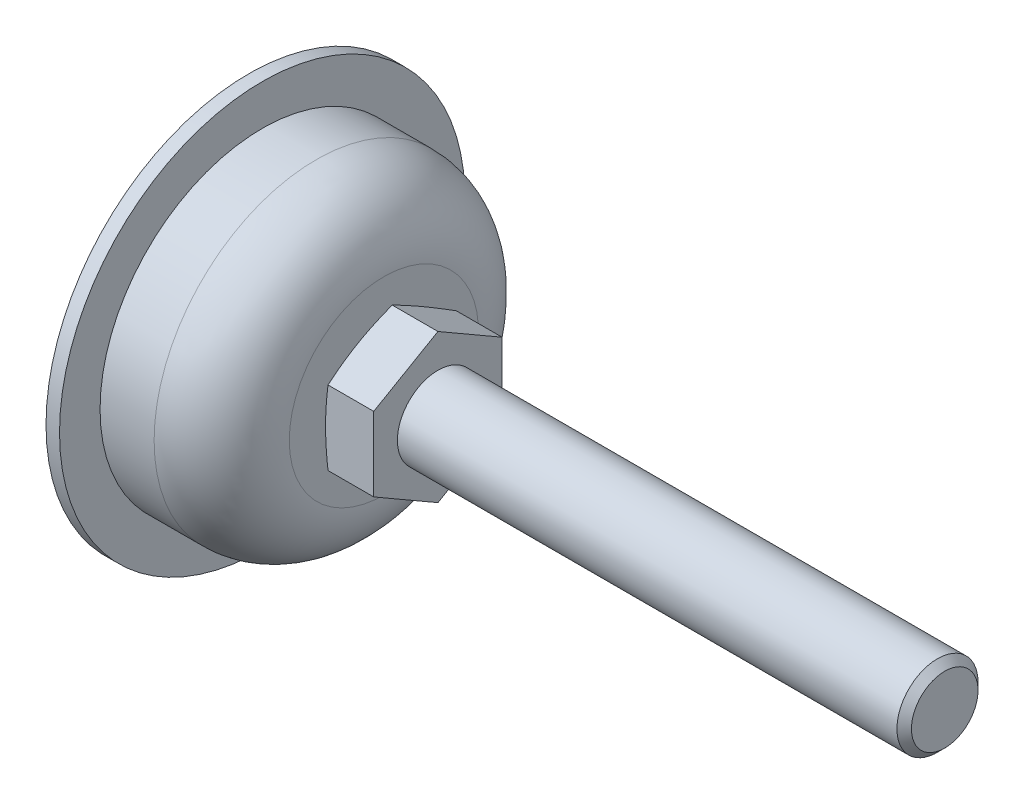
ISO-10303-21;
HEADER;
FILE_DESCRIPTION(('STEP AP214'),'2;1');
FILE_NAME('part.step','',(''),(''),'','','');
FILE_SCHEMA(('AUTOMOTIVE_DESIGN { 1 0 10303 214 1 1 1 1 }'));
ENDSEC;
DATA;
#1=APPLICATION_CONTEXT('core data for automotive mechanical design processes');
#2=APPLICATION_PROTOCOL_DEFINITION('international standard','automotive_design',2000,#1);
#3=PRODUCT_CONTEXT('',#1,'mechanical');
#4=PRODUCT('Part','Part','',(#3));
#5=PRODUCT_RELATED_PRODUCT_CATEGORY('part','',(#4));
#6=PRODUCT_DEFINITION_FORMATION('','',#4);
#7=PRODUCT_DEFINITION_CONTEXT('part definition',#1,'design');
#8=PRODUCT_DEFINITION('design','',#6,#7);
#9=PRODUCT_DEFINITION_SHAPE('','',#8);
#10=(LENGTH_UNIT() NAMED_UNIT(*) SI_UNIT(.MILLI.,.METRE.));
#11=(NAMED_UNIT(*) PLANE_ANGLE_UNIT() SI_UNIT($,.RADIAN.));
#12=(NAMED_UNIT(*) SI_UNIT($,.STERADIAN.) SOLID_ANGLE_UNIT());
#13=UNCERTAINTY_MEASURE_WITH_UNIT(LENGTH_MEASURE(1.E-05),#10,'distance_accuracy_value','');
#14=(GEOMETRIC_REPRESENTATION_CONTEXT(3) GLOBAL_UNCERTAINTY_ASSIGNED_CONTEXT((#13)) GLOBAL_UNIT_ASSIGNED_CONTEXT((#10,
#11,#12)) REPRESENTATION_CONTEXT('',''));
#15=CARTESIAN_POINT('',(0.,0.,0.));
#16=DIRECTION('',(0.,0.,1.));
#17=DIRECTION('',(1.,0.,0.));
#18=AXIS2_PLACEMENT_3D('',#15,#16,#17);
#19=CARTESIAN_POINT('',(20.,5.4848275573014,-9.5));
#20=DIRECTION('',(0.,0.866025403784432,-0.500000000000011));
#21=DIRECTION('',(0.,0.500000000000011,0.866025403784432));
#22=AXIS2_PLACEMENT_3D('',#19,#20,#21);
#23=PLANE('',#22);
#24=CARTESIAN_POINT('',(21.2363135473318,10.9696551146014,-2.83738518010629E-12));
#25=CARTESIAN_POINT('',(21.1796025206193,10.7417796133134,-0.39469194603377));
#26=CARTESIAN_POINT('',(21.1281356347118,10.5135471527352,-0.790002163691614));
#27=CARTESIAN_POINT('',(21.0377338744024,10.0563872687917,-1.58182630986411));
#28=CARTESIAN_POINT('',(20.9988033550502,9.82745963174504,-1.97834060848559));
#29=CARTESIAN_POINT('',(20.9357010995206,9.37010728521882,-2.77049810962984));
#30=CARTESIAN_POINT('',(20.9114644096468,9.14168487616794,-3.16613732769323));
#31=CARTESIAN_POINT('',(20.8789670631554,8.68458873301923,-3.95785107157056));
#32=CARTESIAN_POINT('',(20.8707037649087,8.4559150467366,-4.35392551456613));
#33=CARTESIAN_POINT('',(20.8707037637354,7.99856767415284,-5.14607440058931));
#34=CARTESIAN_POINT('',(20.8789670608093,7.76989398785171,-5.54214884361692));
#35=CARTESIAN_POINT('',(20.911464405033,7.31279784464755,-6.33386258759027));
#36=CARTESIAN_POINT('',(20.9357010938117,7.08437543555973,-6.72950180571766));
#37=CARTESIAN_POINT('',(20.998803347279,6.62702308894837,-7.52165930700936));
#38=CARTESIAN_POINT('',(21.0377338656645,6.39809545185347,-7.9181736057144));
#39=CARTESIAN_POINT('',(21.1281356241903,5.94093556780653,-8.70999775206598));
#40=CARTESIAN_POINT('',(21.1796025092811,5.71270310717321,-9.10530796981933));
#41=CARTESIAN_POINT('',(21.2363135352593,5.48482760583112,-9.49999991594406));
#42=B_SPLINE_CURVE_WITH_KNOTS('',3,(#24,#25,#26,#27,#28,#29,#30,#31,#32,#33,#34,#35,#36,#37,#38,
#39,#40,#41),.UNSPECIFIED.,.F.,.F.,(4,2,2,2,2,2,2,2,4),(0.,1.37785904683427,2.75619623756216,
4.12839523405715,5.50036728119311,6.87233932837504,8.24453832491363,9.62287551568004,
11.0007345625643),.UNSPECIFIED.);
#43=CARTESIAN_POINT('',(21.2363135473339,10.969655114603,0.));
#44=VERTEX_POINT('',#43);
#45=CARTESIAN_POINT('',(21.2363135473339,5.4848275573014,-9.5));
#46=VERTEX_POINT('',#45);
#47=EDGE_CURVE('E130',#44,#46,#42,.T.);
#48=ORIENTED_EDGE('',*,*,#47,.F.);
#49=DIRECTION('',(-1.,0.,0.));
#50=VECTOR('',#49,1.);
#51=CARTESIAN_POINT('',(28.,10.969655114603,0.));
#52=LINE('',#51,#50);
#53=CARTESIAN_POINT('',(28.,10.969655114603,0.));
#54=VERTEX_POINT('',#53);
#55=EDGE_CURVE('E119',#54,#44,#52,.T.);
#56=ORIENTED_EDGE('',*,*,#55,.F.);
#57=DIRECTION('',(0.,0.500000000000011,0.866025403784432));
#58=VECTOR('',#57,1.);
#59=CARTESIAN_POINT('',(28.,10.969655114603,0.));
#60=LINE('',#59,#58);
#61=CARTESIAN_POINT('',(28.,5.4848275573014,-9.5));
#62=VERTEX_POINT('',#61);
#63=EDGE_CURVE('E107',#62,#54,#60,.T.);
#64=ORIENTED_EDGE('',*,*,#63,.F.);
#65=DIRECTION('',(-1.,0.,0.));
#66=VECTOR('',#65,1.);
#67=CARTESIAN_POINT('',(28.,5.4848275573014,-9.5));
#68=LINE('',#67,#66);
#69=EDGE_CURVE('E273',#62,#46,#68,.T.);
#70=ORIENTED_EDGE('',*,*,#69,.T.);
#71=EDGE_LOOP('',(#48,#56,#64,#70));
#72=FACE_BOUND('',#71,.T.);
#73=ADVANCED_FACE('F40',(#72),#23,.T.);
#74=CARTESIAN_POINT('',(20.,-5.4848275573014,-9.5));
#75=DIRECTION('',(0.,0.,-1.));
#76=DIRECTION('',(-1.,0.,0.));
#77=AXIS2_PLACEMENT_3D('',#74,#75,#76);
#78=PLANE('',#77);
#79=CARTESIAN_POINT('',(21.2363135868258,5.48482759939457,-9.49999995796774));
#80=CARTESIAN_POINT('',(21.1796025378282,5.02907659701606,-9.49999998490571));
#81=CARTESIAN_POINT('',(21.1281356424214,4.57261167461967,-9.49999999595545));
#82=CARTESIAN_POINT('',(21.037733874454,3.65829190312086,-9.50000000404596));
#83=CARTESIAN_POINT('',(20.9988033569429,3.20043662665583,-9.50000000108186));
#84=CARTESIAN_POINT('',(20.9357011021749,2.28573192940763,-9.49999999892296));
#85=CARTESIAN_POINT('',(20.9114644112277,1.8288871094809,-9.49999999971142));
#86=CARTESIAN_POINT('',(20.8789670635043,0.914694819364156,-9.50000000028853));
#87=CARTESIAN_POINT('',(20.870703765101,0.457347444804493,-9.50000000007734));
#88=CARTESIAN_POINT('',(20.8707037635431,-0.457347304044417,-9.49999999992266));
#89=CARTESIAN_POINT('',(20.8789670603785,-0.914694678333665,-9.49999999997917));
#90=CARTESIAN_POINT('',(20.9114644043119,-1.82888696807866,-9.50000000002083));
#91=CARTESIAN_POINT('',(20.9357010930374,-2.28573178790406,-9.50000000000596));
#92=CARTESIAN_POINT('',(20.9988033465166,-3.20043648462128,-9.49999999999401));
#93=CARTESIAN_POINT('',(21.0377338649741,-3.65829176065535,-9.49999999999701));
#94=CARTESIAN_POINT('',(21.1281356237596,-4.57261153249546,-9.50000000000299));
#95=CARTESIAN_POINT('',(21.1796025090401,-5.02907645566386,-9.50000000000598));
#96=CARTESIAN_POINT('',(21.2363135352595,-5.48482746024407,-9.5));
#97=B_SPLINE_CURVE_WITH_KNOTS('',3,(#79,#80,#81,#82,#83,#84,#85,#86,#87,#88,#89,#90,#91,#92,#93,
#94,#95,#96),.UNSPECIFIED.,.F.,.F.,(4,2,2,2,2,2,2,2,4),(0.,1.3778590537026,2.75619625085898,
4.12839525310159,5.50036730617691,6.87233935842028,8.24453835988346,9.62287555618,
11.000734608796),.UNSPECIFIED.);
#98=CARTESIAN_POINT('',(21.2363135473339,-5.4848275573014,-9.5));
#99=VERTEX_POINT('',#98);
#100=EDGE_CURVE('E274',#46,#99,#97,.T.);
#101=ORIENTED_EDGE('',*,*,#100,.F.);
#102=ORIENTED_EDGE('',*,*,#69,.F.);
#103=DIRECTION('',(0.,1.,0.));
#104=VECTOR('',#103,1.);
#105=CARTESIAN_POINT('',(28.,5.4848275573014,-9.5));
#106=LINE('',#105,#104);
#107=CARTESIAN_POINT('',(28.,-5.4848275573014,-9.5));
#108=VERTEX_POINT('',#107);
#109=EDGE_CURVE('E94',#108,#62,#106,.T.);
#110=ORIENTED_EDGE('',*,*,#109,.F.);
#111=DIRECTION('',(-1.,0.,0.));
#112=VECTOR('',#111,1.);
#113=CARTESIAN_POINT('',(28.,-5.4848275573014,-9.5));
#114=LINE('',#113,#112);
#115=EDGE_CURVE('E131',#108,#99,#114,.T.);
#116=ORIENTED_EDGE('',*,*,#115,.T.);
#117=EDGE_LOOP('',(#101,#102,#110,#116));
#118=FACE_BOUND('',#117,.T.);
#119=ADVANCED_FACE('F196',(#118),#78,.T.);
#120=CARTESIAN_POINT('',(20.,-10.969655114603,0.));
#121=DIRECTION('',(0.,-0.866025403784432,-0.500000000000011));
#122=DIRECTION('',(0.,0.500000000000011,-0.866025403784432));
#123=AXIS2_PLACEMENT_3D('',#120,#121,#122);
#124=PLANE('',#123);
#125=CARTESIAN_POINT('',(21.2363135868249,-5.48482749985547,-9.50000001543606));
#126=CARTESIAN_POINT('',(21.1796025373199,-5.71270302640907,-9.10530807951882));
#127=CARTESIAN_POINT('',(21.1281356415007,-5.94093549921924,-8.70999786277367));
#128=CARTESIAN_POINT('',(21.0377338729505,-6.39809539607311,-7.9181737104206));
#129=CARTESIAN_POINT('',(20.9988033552693,-6.62702303379391,-7.52165940470337));
#130=CARTESIAN_POINT('',(20.9357011004589,-7.08437538464087,-6.72950189175765));
#131=CARTESIAN_POINT('',(20.9114644096371,-7.31279779732426,-6.33386266897947));
#132=CARTESIAN_POINT('',(20.8789670624784,-7.76989394695368,-5.54214891503144));
#133=CARTESIAN_POINT('',(20.8707037645143,-7.99856763608466,-5.14607446667999));
#134=CARTESIAN_POINT('',(20.8707037641298,-8.45591501442477,-4.35392557037717));
#135=CARTESIAN_POINT('',(20.8789670616987,-8.68458870363389,-3.9578511224258));
#136=CARTESIAN_POINT('',(20.9114644073351,-9.14168485255828,-3.16613736862801));
#137=CARTESIAN_POINT('',(20.9357010970303,-9.37010726445837,-2.77049814559992));
#138=CARTESIAN_POINT('',(20.9988033526142,-9.827459616814,-1.97834063433495));
#139=CARTESIAN_POINT('',(21.0377338722084,-10.0563872568406,-1.581826330558));
#140=CARTESIAN_POINT('',(21.1281356333604,-10.5135471467604,-0.79000217404625));
#141=CARTESIAN_POINT('',(21.1796025198703,-10.7417796103349,-0.394691951204752));
#142=CARTESIAN_POINT('',(21.2363135473318,-10.9696551146014,-2.83553559383945E-12));
#143=B_SPLINE_CURVE_WITH_KNOTS('',3,(#125,#126,#127,#128,#129,#130,#131,#132,#133,#134,#135,
#136,#137,#138,#139,#140,#141,#142),.UNSPECIFIED.,.F.,.F.,(4,2,2,2,2,2,2,2,4),(0.,
1.37785906601407,2.75619627549509,4.12839528991556,5.50036735516085,6.87233941952822,
8.24453843312567,9.62287564170834,11.0007347065858),.UNSPECIFIED.);
#144=CARTESIAN_POINT('',(21.2363135473339,-10.969655114603,0.));
#145=VERTEX_POINT('',#144);
#146=EDGE_CURVE('E222',#99,#145,#143,.T.);
#147=ORIENTED_EDGE('',*,*,#146,.F.);
#148=ORIENTED_EDGE('',*,*,#115,.F.);
#149=DIRECTION('',(0.,0.500000000000011,-0.866025403784432));
#150=VECTOR('',#149,1.);
#151=CARTESIAN_POINT('',(28.,-5.4848275573014,-9.5));
#152=LINE('',#151,#150);
#153=CARTESIAN_POINT('',(28.,-10.969655114603,0.));
#154=VERTEX_POINT('',#153);
#155=EDGE_CURVE('E269',#154,#108,#152,.T.);
#156=ORIENTED_EDGE('',*,*,#155,.F.);
#157=DIRECTION('',(-1.,0.,0.));
#158=VECTOR('',#157,1.);
#159=CARTESIAN_POINT('',(28.,-10.969655114603,0.));
#160=LINE('',#159,#158);
#161=EDGE_CURVE('E86',#154,#145,#160,.T.);
#162=ORIENTED_EDGE('',*,*,#161,.T.);
#163=EDGE_LOOP('',(#147,#148,#156,#162));
#164=FACE_BOUND('',#163,.T.);
#165=ADVANCED_FACE('F337',(#164),#124,.T.);
#166=CARTESIAN_POINT('',(20.,-5.4848275573014,9.5));
#167=DIRECTION('',(0.,-0.866025403784432,0.500000000000011));
#168=DIRECTION('',(0.,-0.500000000000011,-0.866025403784432));
#169=AXIS2_PLACEMENT_3D('',#166,#167,#168);
#170=PLANE('',#169);
#171=CARTESIAN_POINT('',(21.2363135473318,-10.9696551146014,2.83695883919445E-12));
#172=CARTESIAN_POINT('',(21.1796025206193,-10.7417796133133,0.394691946034018));
#173=CARTESIAN_POINT('',(21.1281356347117,-10.513547152735,0.790002163692111));
#174=CARTESIAN_POINT('',(21.0377338744023,-10.0563872687911,1.5818263098651));
#175=CARTESIAN_POINT('',(20.99880335505,-9.82745963174433,1.97834060848684));
#176=CARTESIAN_POINT('',(20.9357010995205,-9.37010728521781,2.77049810963159));
#177=CARTESIAN_POINT('',(20.9114644096467,-9.14168487616679,3.16613732769522));
#178=CARTESIAN_POINT('',(20.8789670631553,-8.68458873301779,3.95785107157304));
#179=CARTESIAN_POINT('',(20.8707037649086,-8.45591504673502,4.35392551456886));
#180=CARTESIAN_POINT('',(20.8707037637354,-7.99856767415097,5.14607440059254));
#181=CARTESIAN_POINT('',(20.8789670608094,-7.7698939878497,5.54214884362039));
#182=CARTESIAN_POINT('',(20.9114644050332,-7.31279784464526,6.33386258759424));
#183=CARTESIAN_POINT('',(20.935701093812,-7.0843754355573,6.72950180572187));
#184=CARTESIAN_POINT('',(20.9988033472794,-6.62702308894566,7.52165930701406));
#185=CARTESIAN_POINT('',(21.0377338656651,-6.39809545185062,7.91817360571935));
#186=CARTESIAN_POINT('',(21.128135624191,-5.9409355678034,8.70999775207141));
#187=CARTESIAN_POINT('',(21.1796025092818,-5.71270310716994,9.10530796982501));
#188=CARTESIAN_POINT('',(21.2363135352601,-5.48482760582771,9.49999991594997));
#189=B_SPLINE_CURVE_WITH_KNOTS('',3,(#171,#172,#173,#174,#175,#176,#177,#178,#179,#180,#181,
#182,#183,#184,#185,#186,#187,#188),.UNSPECIFIED.,.F.,.F.,(4,2,2,2,2,2,2,2,4),(0.,
1.37785904683514,2.75619623756389,4.12839523405974,5.50036728119655,6.87233932837934,
8.24453832491879,9.62287551568606,11.0007345625712),.UNSPECIFIED.);
#190=CARTESIAN_POINT('',(21.2363135473339,-5.4848275573014,9.5));
#191=VERTEX_POINT('',#190);
#192=EDGE_CURVE('E168',#145,#191,#189,.T.);
#193=ORIENTED_EDGE('',*,*,#192,.F.);
#194=ORIENTED_EDGE('',*,*,#161,.F.);
#195=DIRECTION('',(0.,-0.500000000000011,-0.866025403784432));
#196=VECTOR('',#195,1.);
#197=CARTESIAN_POINT('',(28.,-10.969655114603,0.));
#198=LINE('',#197,#196);
#199=CARTESIAN_POINT('',(28.,-5.4848275573014,9.5));
#200=VERTEX_POINT('',#199);
#201=EDGE_CURVE('E63',#200,#154,#198,.T.);
#202=ORIENTED_EDGE('',*,*,#201,.F.);
#203=DIRECTION('',(-1.,0.,0.));
#204=VECTOR('',#203,1.);
#205=CARTESIAN_POINT('',(28.,-5.4848275573014,9.5));
#206=LINE('',#205,#204);
#207=EDGE_CURVE('E55',#200,#191,#206,.T.);
#208=ORIENTED_EDGE('',*,*,#207,.T.);
#209=EDGE_LOOP('',(#193,#194,#202,#208));
#210=FACE_BOUND('',#209,.T.);
#211=ADVANCED_FACE('F157',(#210),#170,.T.);
#212=CARTESIAN_POINT('',(20.,5.4848275573014,9.5));
#213=DIRECTION('',(0.,0.,1.));
#214=DIRECTION('',(1.,0.,0.));
#215=AXIS2_PLACEMENT_3D('',#212,#213,#214);
#216=PLANE('',#215);
#217=CARTESIAN_POINT('',(21.2363135868231,-5.48482759938752,9.49999995796987));
#218=CARTESIAN_POINT('',(21.1796025378267,-5.02907659700856,9.49999998490647));
#219=CARTESIAN_POINT('',(21.1281356424204,-4.57261167461178,9.49999999595565));
#220=CARTESIAN_POINT('',(21.0377338744534,-3.65829190311226,9.50000000404575));
#221=CARTESIAN_POINT('',(20.9988033569422,-3.20043662664691,9.50000000108181));
#222=CARTESIAN_POINT('',(20.9357011021743,-2.28573192939803,9.49999999892301));
#223=CARTESIAN_POINT('',(20.9114644112273,-1.82888710947095,9.49999999971144));
#224=CARTESIAN_POINT('',(20.878967063504,-0.914694819353517,9.50000000028852));
#225=CARTESIAN_POINT('',(20.8707037651008,-0.457347444793516,9.50000000007734));
#226=CARTESIAN_POINT('',(20.8707037635432,0.45734730405608,9.49999999992266));
#227=CARTESIAN_POINT('',(20.8789670603788,0.914694678345675,9.49999999997917));
#228=CARTESIAN_POINT('',(20.9114644043125,1.82888696809136,9.50000000002083));
#229=CARTESIAN_POINT('',(20.9357010930382,2.28573178791711,9.50000000000596));
#230=CARTESIAN_POINT('',(20.9988033465177,3.200436484635,9.49999999999401));
#231=CARTESIAN_POINT('',(21.0377338649753,3.65829176066941,9.49999999999701));
#232=CARTESIAN_POINT('',(21.1281356237612,4.57261153251017,9.50000000000299));
#233=CARTESIAN_POINT('',(21.1796025090419,5.0290764556789,9.50000000000598));
#234=CARTESIAN_POINT('',(21.2363135352614,5.48482746025943,9.5));
#235=B_SPLINE_CURVE_WITH_KNOTS('',3,(#217,#218,#219,#220,#221,#222,#223,#224,#225,#226,#227,
#228,#229,#230,#231,#232,#233,#234),.UNSPECIFIED.,.F.,.F.,(4,2,2,2,2,2,2,2,4),(0.,
1.37785905370358,2.75619625086096,4.12839525310459,5.50036730618093,6.87233935842535,
8.24453835988958,9.62287555618716,11.0007346088042),.UNSPECIFIED.);
#236=CARTESIAN_POINT('',(21.2363135473339,5.4848275573014,9.5));
#237=VERTEX_POINT('',#236);
#238=EDGE_CURVE('E135',#191,#237,#235,.T.);
#239=ORIENTED_EDGE('',*,*,#238,.F.);
#240=ORIENTED_EDGE('',*,*,#207,.F.);
#241=DIRECTION('',(0.,-1.,0.));
#242=VECTOR('',#241,1.);
#243=CARTESIAN_POINT('',(28.,-5.4848275573014,9.5));
#244=LINE('',#243,#242);
#245=CARTESIAN_POINT('',(28.,5.4848275573014,9.5));
#246=VERTEX_POINT('',#245);
#247=EDGE_CURVE('E105',#246,#200,#244,.T.);
#248=ORIENTED_EDGE('',*,*,#247,.F.);
#249=DIRECTION('',(-1.,0.,0.));
#250=VECTOR('',#249,1.);
#251=CARTESIAN_POINT('',(28.,5.4848275573014,9.5));
#252=LINE('',#251,#250);
#253=EDGE_CURVE('E112',#246,#237,#252,.T.);
#254=ORIENTED_EDGE('',*,*,#253,.T.);
#255=EDGE_LOOP('',(#239,#240,#248,#254));
#256=FACE_BOUND('',#255,.T.);
#257=ADVANCED_FACE('F121',(#256),#216,.T.);
#258=CARTESIAN_POINT('',(20.,10.969655114603,0.));
#259=DIRECTION('',(0.,0.866025403784432,0.500000000000011));
#260=DIRECTION('',(0.,-0.500000000000011,0.866025403784432));
#261=AXIS2_PLACEMENT_3D('',#258,#259,#260);
#262=PLANE('',#261);
#263=CARTESIAN_POINT('',(21.2363135868161,5.48482749985181,9.50000001547505));
#264=CARTESIAN_POINT('',(21.179602537319,5.71270302639745,9.10530807955068));
#265=CARTESIAN_POINT('',(21.1281356415028,5.94093549920473,8.70999786280195));
#266=CARTESIAN_POINT('',(21.0377338729544,6.39809539605731,7.91817371044483));
#267=CARTESIAN_POINT('',(20.9988033552718,6.62702303377972,7.5216594047271));
#268=CARTESIAN_POINT('',(20.93570110046,7.08437538462874,6.7295018917795));
#269=CARTESIAN_POINT('',(20.9114644096381,7.31279779731258,6.33386266899992));
#270=CARTESIAN_POINT('',(20.878967062479,7.76989394694321,5.54214891504935));
#271=CARTESIAN_POINT('',(20.8707037645146,7.99856763607496,5.14607446669674));
#272=CARTESIAN_POINT('',(20.8707037641295,8.45591501441657,4.35392557039144));
#273=CARTESIAN_POINT('',(20.8789670616983,8.68458870362643,3.95785112243873));
#274=CARTESIAN_POINT('',(20.9114644073345,9.14168485255234,3.16613736863829));
#275=CARTESIAN_POINT('',(20.9357010970296,9.3701072644532,2.77049814560886));
#276=CARTESIAN_POINT('',(20.9988033526136,9.82745961681034,1.97834063434128));
#277=CARTESIAN_POINT('',(21.0377338722079,10.0563872568377,1.58182633056304));
#278=CARTESIAN_POINT('',(21.1281356333601,10.513547146759,0.790002174048756));
#279=CARTESIAN_POINT('',(21.1796025198701,10.7417796103341,0.394691951206003));
#280=CARTESIAN_POINT('',(21.2363135473318,10.9696551146014,2.83796577557194E-12));
#281=B_SPLINE_CURVE_WITH_KNOTS('',3,(#263,#264,#265,#266,#267,#268,#269,#270,#271,#272,#273,
#274,#275,#276,#277,#278,#279,#280),.UNSPECIFIED.,.F.,.F.,(4,2,2,2,2,2,2,2,4),(0.,
1.37785906601796,2.75619627550306,4.1283952899278,5.50036735517727,6.87233941954918,
8.24453843315123,9.62287564173836,11.0007347066202),.UNSPECIFIED.);
#282=EDGE_CURVE('E115',#237,#44,#281,.T.);
#283=ORIENTED_EDGE('',*,*,#282,.F.);
#284=ORIENTED_EDGE('',*,*,#253,.F.);
#285=DIRECTION('',(0.,-0.500000000000011,0.866025403784432));
#286=VECTOR('',#285,1.);
#287=CARTESIAN_POINT('',(28.,5.4848275573014,9.5));
#288=LINE('',#287,#286);
#289=EDGE_CURVE('E101',#54,#246,#288,.T.);
#290=ORIENTED_EDGE('',*,*,#289,.F.);
#291=ORIENTED_EDGE('',*,*,#55,.T.);
#292=EDGE_LOOP('',(#283,#284,#290,#291));
#293=FACE_BOUND('',#292,.T.);
#294=ADVANCED_FACE('F113',(#293),#262,.T.);
#295=CARTESIAN_POINT('',(21.243731428612,0.,0.));
#296=DIRECTION('',(1.,0.,0.));
#297=DIRECTION('',(0.,0.,-1.));
#298=AXIS2_PLACEMENT_3D('',#295,#296,#297);
#299=CONICAL_SURFACE('',#298,10.999473045274,1.32697328719106);
#300=ORIENTED_EDGE('',*,*,#146,.T.);
#301=ORIENTED_EDGE('',*,*,#192,.T.);
#302=ORIENTED_EDGE('',*,*,#238,.T.);
#303=ORIENTED_EDGE('',*,*,#282,.T.);
#304=ORIENTED_EDGE('',*,*,#47,.T.);
#305=ORIENTED_EDGE('',*,*,#100,.T.);
#306=EDGE_LOOP('',(#300,#301,#302,#303,#304,#305));
#307=FACE_BOUND('',#306,.T.);
#308=CARTESIAN_POINT('',(20.,0.,0.));
#309=DIRECTION('',(1.,0.,0.));
#310=DIRECTION('',(0.,1.,0.));
#311=AXIS2_PLACEMENT_3D('',#308,#309,#310);
#312=CIRCLE('',#311,5.99999999998778);
#313=CARTESIAN_POINT('',(20.,5.99999999998778,0.));
#314=VERTEX_POINT('',#313);
#315=EDGE_CURVE('E126',#314,#314,#312,.F.);
#316=ORIENTED_EDGE('',*,*,#315,.F.);
#317=EDGE_LOOP('',(#316));
#318=FACE_BOUND('',#317,.T.);
#319=ADVANCED_FACE('F148',(#307,#318),#299,.T.);
#320=CARTESIAN_POINT('',(28.,0.,0.));
#321=DIRECTION('',(-1.,0.,0.));
#322=DIRECTION('',(0.,0.,1.));
#323=AXIS2_PLACEMENT_3D('',#320,#321,#322);
#324=PLANE('',#323);
#325=CARTESIAN_POINT('',(28.,0.,0.));
#326=DIRECTION('',(1.,0.,0.));
#327=DIRECTION('',(0.,1.,0.));
#328=AXIS2_PLACEMENT_3D('',#325,#326,#327);
#329=CIRCLE('',#328,6.);
#330=CARTESIAN_POINT('',(28.,6.00000000000001,0.));
#331=VERTEX_POINT('',#330);
#332=EDGE_CURVE('E257',#331,#331,#329,.T.);
#333=ORIENTED_EDGE('',*,*,#332,.F.);
#334=EDGE_LOOP('',(#333));
#335=FACE_BOUND('',#334,.T.);
#336=ORIENTED_EDGE('',*,*,#155,.T.);
#337=ORIENTED_EDGE('',*,*,#109,.T.);
#338=ORIENTED_EDGE('',*,*,#63,.T.);
#339=ORIENTED_EDGE('',*,*,#289,.T.);
#340=ORIENTED_EDGE('',*,*,#247,.T.);
#341=ORIENTED_EDGE('',*,*,#201,.T.);
#342=EDGE_LOOP('',(#336,#337,#338,#339,#340,#341));
#343=FACE_BOUND('',#342,.T.);
#344=ADVANCED_FACE('F103',(#335,#343),#324,.F.);
#345=CARTESIAN_POINT('',(1.99999999999999,0.,0.));
#346=DIRECTION('',(1.,0.,0.));
#347=DIRECTION('',(0.,0.,-1.));
#348=AXIS2_PLACEMENT_3D('',#345,#346,#347);
#349=CYLINDRICAL_SURFACE('',#348,24.);
#350=CARTESIAN_POINT('',(9.99999999999838,0.,0.));
#351=DIRECTION('',(-1.,0.,0.));
#352=DIRECTION('',(0.,0.,1.));
#353=AXIS2_PLACEMENT_3D('',#350,#351,#352);
#354=CIRCLE('',#353,24.);
#355=CARTESIAN_POINT('',(9.99999999999838,0.,24.));
#356=VERTEX_POINT('',#355);
#357=EDGE_CURVE('E13',#356,#356,#354,.T.);
#358=ORIENTED_EDGE('',*,*,#357,.T.);
#359=EDGE_LOOP('',(#358));
#360=FACE_BOUND('',#359,.T.);
#361=CARTESIAN_POINT('',(2.,0.,0.));
#362=DIRECTION('',(-1.,0.,0.));
#363=DIRECTION('',(0.,0.,1.));
#364=AXIS2_PLACEMENT_3D('',#361,#362,#363);
#365=CIRCLE('',#364,24.);
#366=CARTESIAN_POINT('',(2.,0.,24.));
#367=VERTEX_POINT('',#366);
#368=EDGE_CURVE('E265',#367,#367,#365,.F.);
#369=ORIENTED_EDGE('',*,*,#368,.T.);
#370=EDGE_LOOP('',(#369));
#371=FACE_BOUND('',#370,.T.);
#372=ADVANCED_FACE('F218',(#360,#371),#349,.T.);
#373=CARTESIAN_POINT('',(20.,0.,0.));
#374=DIRECTION('',(-1.,0.,0.));
#375=DIRECTION('',(0.,0.,1.));
#376=AXIS2_PLACEMENT_3D('',#373,#374,#375);
#377=PLANE('',#376);
#378=CARTESIAN_POINT('',(20.,0.,0.));
#379=DIRECTION('',(-1.,0.,0.));
#380=DIRECTION('',(0.,0.,1.));
#381=AXIS2_PLACEMENT_3D('',#378,#379,#380);
#382=CIRCLE('',#381,13.9999999999984);
#383=CARTESIAN_POINT('',(20.,0.,13.9999999999984));
#384=VERTEX_POINT('',#383);
#385=EDGE_CURVE('E48',#384,#384,#382,.F.);
#386=ORIENTED_EDGE('',*,*,#385,.T.);
#387=EDGE_LOOP('',(#386));
#388=FACE_BOUND('',#387,.T.);
#389=ORIENTED_EDGE('',*,*,#315,.T.);
#390=EDGE_LOOP('',(#389));
#391=FACE_BOUND('',#390,.T.);
#392=ADVANCED_FACE('F225',(#388,#391),#377,.F.);
#393=CARTESIAN_POINT('',(0.,0.,0.));
#394=DIRECTION('',(1.,0.,0.));
#395=DIRECTION('',(0.,0.,-1.));
#396=AXIS2_PLACEMENT_3D('',#393,#394,#395);
#397=CYLINDRICAL_SURFACE('',#396,30.);
#398=CARTESIAN_POINT('',(0.,0.,0.));
#399=DIRECTION('',(1.,0.,0.));
#400=DIRECTION('',(0.,0.,1.));
#401=AXIS2_PLACEMENT_3D('',#398,#399,#400);
#402=CIRCLE('',#401,30.);
#403=CARTESIAN_POINT('',(0.,0.,30.));
#404=VERTEX_POINT('',#403);
#405=EDGE_CURVE('E261',#404,#404,#402,.T.);
#406=ORIENTED_EDGE('',*,*,#405,.T.);
#407=EDGE_LOOP('',(#406));
#408=FACE_BOUND('',#407,.T.);
#409=CARTESIAN_POINT('',(2.,0.,0.));
#410=DIRECTION('',(1.,0.,0.));
#411=DIRECTION('',(0.,0.,1.));
#412=AXIS2_PLACEMENT_3D('',#409,#410,#411);
#413=CIRCLE('',#412,30.);
#414=CARTESIAN_POINT('',(2.,0.,30.));
#415=VERTEX_POINT('',#414);
#416=EDGE_CURVE('E258',#415,#415,#413,.T.);
#417=ORIENTED_EDGE('',*,*,#416,.F.);
#418=EDGE_LOOP('',(#417));
#419=FACE_BOUND('',#418,.T.);
#420=ADVANCED_FACE('F227',(#408,#419),#397,.T.);
#421=CARTESIAN_POINT('',(0.,0.,0.));
#422=DIRECTION('',(-1.,0.,0.));
#423=DIRECTION('',(0.,0.,1.));
#424=AXIS2_PLACEMENT_3D('',#421,#422,#423);
#425=PLANE('',#424);
#426=ORIENTED_EDGE('',*,*,#405,.F.);
#427=EDGE_LOOP('',(#426));
#428=FACE_BOUND('',#427,.T.);
#429=ADVANCED_FACE('F234',(#428),#425,.T.);
#430=CARTESIAN_POINT('',(2.,0.,0.));
#431=DIRECTION('',(-1.,0.,0.));
#432=DIRECTION('',(0.,0.,1.));
#433=AXIS2_PLACEMENT_3D('',#430,#431,#432);
#434=PLANE('',#433);
#435=ORIENTED_EDGE('',*,*,#368,.F.);
#436=EDGE_LOOP('',(#435));
#437=FACE_BOUND('',#436,.T.);
#438=ORIENTED_EDGE('',*,*,#416,.T.);
#439=EDGE_LOOP('',(#438));
#440=FACE_BOUND('',#439,.T.);
#441=ADVANCED_FACE('F241',(#437,#440),#434,.F.);
#442=CARTESIAN_POINT('',(28.,0.,0.));
#443=DIRECTION('',(1.,0.,0.));
#444=DIRECTION('',(0.,1.,0.));
#445=AXIS2_PLACEMENT_3D('',#442,#443,#444);
#446=CYLINDRICAL_SURFACE('',#445,6.);
#447=CARTESIAN_POINT('',(101.926499999972,0.,0.));
#448=DIRECTION('',(1.,0.,0.));
#449=DIRECTION('',(0.,1.,0.));
#450=AXIS2_PLACEMENT_3D('',#447,#448,#449);
#451=CIRCLE('',#450,6.);
#452=CARTESIAN_POINT('',(101.926499999972,6.00000000000001,0.));
#453=VERTEX_POINT('',#452);
#454=EDGE_CURVE('E254',#453,#453,#451,.F.);
#455=ORIENTED_EDGE('',*,*,#454,.T.);
#456=EDGE_LOOP('',(#455));
#457=FACE_BOUND('',#456,.T.);
#458=ORIENTED_EDGE('',*,*,#332,.T.);
#459=EDGE_LOOP('',(#458));
#460=FACE_BOUND('',#459,.T.);
#461=ADVANCED_FACE('F208',(#457,#460),#446,.T.);
#462=CARTESIAN_POINT('',(103.,0.,0.));
#463=DIRECTION('',(1.,0.,0.));
#464=DIRECTION('',(0.,1.,0.));
#465=AXIS2_PLACEMENT_3D('',#462,#463,#464);
#466=PLANE('',#465);
#467=CARTESIAN_POINT('',(103.,0.,0.));
#468=DIRECTION('',(1.,0.,0.));
#469=DIRECTION('',(0.,1.,0.));
#470=AXIS2_PLACEMENT_3D('',#467,#468,#469);
#471=CIRCLE('',#470,4.92649999997215);
#472=CARTESIAN_POINT('',(103.,4.92649999997215,0.));
#473=VERTEX_POINT('',#472);
#474=EDGE_CURVE('E134',#473,#473,#471,.T.);
#475=ORIENTED_EDGE('',*,*,#474,.T.);
#476=EDGE_LOOP('',(#475));
#477=FACE_BOUND('',#476,.T.);
#478=ADVANCED_FACE('F201',(#477),#466,.T.);
#479=CARTESIAN_POINT('',(103.,0.,0.));
#480=DIRECTION('',(-1.,0.,0.));
#481=DIRECTION('',(0.,-1.,0.));
#482=AXIS2_PLACEMENT_3D('',#479,#480,#481);
#483=CONICAL_SURFACE('',#482,4.92649999997215,0.785398163397448);
#484=ORIENTED_EDGE('',*,*,#454,.F.);
#485=EDGE_LOOP('',(#484));
#486=FACE_BOUND('',#485,.T.);
#487=ORIENTED_EDGE('',*,*,#474,.F.);
#488=EDGE_LOOP('',(#487));
#489=FACE_BOUND('',#488,.T.);
#490=ADVANCED_FACE('F199',(#486,#489),#483,.T.);
#491=CARTESIAN_POINT('',(9.99999999999838,0.,0.));
#492=DIRECTION('',(-1.,0.,0.));
#493=DIRECTION('',(0.,0.,1.));
#494=AXIS2_PLACEMENT_3D('',#491,#492,#493);
#495=TOROIDAL_SURFACE('',#494,13.9999999999984,10.0000000000016);
#496=ORIENTED_EDGE('',*,*,#357,.F.);
#497=EDGE_LOOP('',(#496));
#498=FACE_BOUND('',#497,.T.);
#499=ORIENTED_EDGE('',*,*,#385,.F.);
#500=EDGE_LOOP('',(#499));
#501=FACE_BOUND('',#500,.T.);
#502=ADVANCED_FACE('F42',(#498,#501),#495,.T.);
#503=CLOSED_SHELL('',(#73,#119,#165,#211,#257,#294,#319,#344,#372,#392,#420,#429,#441,#461,#478,
#490,#502));
#504=MANIFOLD_SOLID_BREP('B2',#503);
#505=ADVANCED_BREP_SHAPE_REPRESENTATION('',(#18,#504),#14);
#506=SHAPE_DEFINITION_REPRESENTATION(#9,#505);
ENDSEC;
END-ISO-10303-21;
